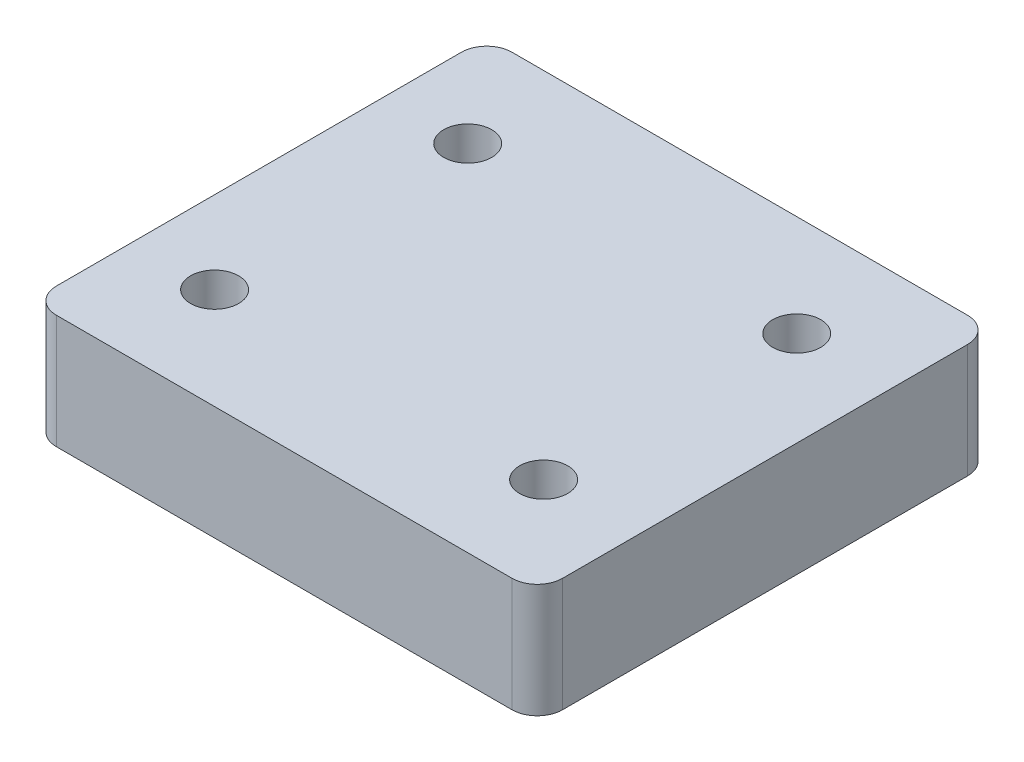
ISO-10303-21;
HEADER;
FILE_DESCRIPTION(('STEP AP214'),'2;1');
FILE_NAME('part.step','',(''),(''),'','','');
FILE_SCHEMA(('AUTOMOTIVE_DESIGN { 1 0 10303 214 1 1 1 1 }'));
ENDSEC;
DATA;
#1=APPLICATION_CONTEXT('core data for automotive mechanical design processes');
#2=APPLICATION_PROTOCOL_DEFINITION('international standard','automotive_design',2000,#1);
#3=PRODUCT_CONTEXT('',#1,'mechanical');
#4=PRODUCT('Part','Part','',(#3));
#5=PRODUCT_RELATED_PRODUCT_CATEGORY('part','',(#4));
#6=PRODUCT_DEFINITION_FORMATION('','',#4);
#7=PRODUCT_DEFINITION_CONTEXT('part definition',#1,'design');
#8=PRODUCT_DEFINITION('design','',#6,#7);
#9=PRODUCT_DEFINITION_SHAPE('','',#8);
#10=(LENGTH_UNIT() NAMED_UNIT(*) SI_UNIT(.MILLI.,.METRE.));
#11=(NAMED_UNIT(*) PLANE_ANGLE_UNIT() SI_UNIT($,.RADIAN.));
#12=(NAMED_UNIT(*) SI_UNIT($,.STERADIAN.) SOLID_ANGLE_UNIT());
#13=UNCERTAINTY_MEASURE_WITH_UNIT(LENGTH_MEASURE(1.E-05),#10,'distance_accuracy_value','');
#14=(GEOMETRIC_REPRESENTATION_CONTEXT(3) GLOBAL_UNCERTAINTY_ASSIGNED_CONTEXT((#13)) GLOBAL_UNIT_ASSIGNED_CONTEXT((#10,
#11,#12)) REPRESENTATION_CONTEXT('',''));
#15=CARTESIAN_POINT('',(0.,0.,0.));
#16=DIRECTION('',(0.,0.,1.));
#17=DIRECTION('',(1.,0.,0.));
#18=AXIS2_PLACEMENT_3D('',#15,#16,#17);
#19=CARTESIAN_POINT('',(-10.5177085809365,9.,-16.6807701449964));
#20=DIRECTION('',(1.,0.,0.));
#21=DIRECTION('',(0.,0.,-1.));
#22=AXIS2_PLACEMENT_3D('',#19,#20,#21);
#23=PLANE('',#22);
#24=DIRECTION('',(0.,0.,1.));
#25=VECTOR('',#24,1.);
#26=CARTESIAN_POINT('',(-10.5177085809365,9.,-16.6807701449964));
#27=LINE('',#26,#25);
#28=CARTESIAN_POINT('',(-10.5177085809365,9.,-14.6807701449964));
#29=VERTEX_POINT('',#28);
#30=CARTESIAN_POINT('',(-10.5177085809365,9.,17.3192298550036));
#31=VERTEX_POINT('',#30);
#32=EDGE_CURVE('E117',#29,#31,#27,.T.);
#33=ORIENTED_EDGE('',*,*,#32,.F.);
#34=DIRECTION('',(0.,-1.,0.));
#35=VECTOR('',#34,1.);
#36=CARTESIAN_POINT('',(-10.5177085809365,9.,-14.6807701449964));
#37=LINE('',#36,#35);
#38=CARTESIAN_POINT('',(-10.5177085809365,0.,-14.6807701449964));
#39=VERTEX_POINT('',#38);
#40=EDGE_CURVE('E102',#29,#39,#37,.T.);
#41=ORIENTED_EDGE('',*,*,#40,.T.);
#42=DIRECTION('',(0.,0.,1.));
#43=VECTOR('',#42,1.);
#44=CARTESIAN_POINT('',(-10.5177085809365,0.,-16.6807701449964));
#45=LINE('',#44,#43);
#46=CARTESIAN_POINT('',(-10.5177085809365,0.,17.3192298550036));
#47=VERTEX_POINT('',#46);
#48=EDGE_CURVE('E114',#39,#47,#45,.T.);
#49=ORIENTED_EDGE('',*,*,#48,.T.);
#50=DIRECTION('',(0.,-1.,0.));
#51=VECTOR('',#50,1.);
#52=CARTESIAN_POINT('',(-10.5177085809365,9.,17.3192298550036));
#53=LINE('',#52,#51);
#54=EDGE_CURVE('E119',#47,#31,#53,.F.);
#55=ORIENTED_EDGE('',*,*,#54,.T.);
#56=EDGE_LOOP('',(#33,#41,#49,#55));
#57=FACE_BOUND('',#56,.T.);
#58=ADVANCED_FACE('F33',(#57),#23,.F.);
#59=CARTESIAN_POINT('',(-10.5177085809365,9.,19.3192298550036));
#60=DIRECTION('',(0.,0.,-1.));
#61=DIRECTION('',(-1.,0.,0.));
#62=AXIS2_PLACEMENT_3D('',#59,#60,#61);
#63=PLANE('',#62);
#64=DIRECTION('',(1.,0.,0.));
#65=VECTOR('',#64,1.);
#66=CARTESIAN_POINT('',(-10.5177085809365,9.,19.3192298550036));
#67=LINE('',#66,#65);
#68=CARTESIAN_POINT('',(-8.5177085809365,9.,19.3192298550036));
#69=VERTEX_POINT('',#68);
#70=CARTESIAN_POINT('',(27.4822914190635,9.,19.3192298550036));
#71=VERTEX_POINT('',#70);
#72=EDGE_CURVE('E181',#69,#71,#67,.T.);
#73=ORIENTED_EDGE('',*,*,#72,.F.);
#74=DIRECTION('',(0.,-1.,0.));
#75=VECTOR('',#74,1.);
#76=CARTESIAN_POINT('',(-8.5177085809365,9.,19.3192298550036));
#77=LINE('',#76,#75);
#78=CARTESIAN_POINT('',(-8.5177085809365,0.,19.3192298550036));
#79=VERTEX_POINT('',#78);
#80=EDGE_CURVE('E165',#69,#79,#77,.T.);
#81=ORIENTED_EDGE('',*,*,#80,.T.);
#82=DIRECTION('',(1.,0.,0.));
#83=VECTOR('',#82,1.);
#84=CARTESIAN_POINT('',(-10.5177085809365,0.,19.3192298550036));
#85=LINE('',#84,#83);
#86=CARTESIAN_POINT('',(27.4822914190635,0.,19.3192298550036));
#87=VERTEX_POINT('',#86);
#88=EDGE_CURVE('E123',#79,#87,#85,.T.);
#89=ORIENTED_EDGE('',*,*,#88,.T.);
#90=DIRECTION('',(0.,-1.,0.));
#91=VECTOR('',#90,1.);
#92=CARTESIAN_POINT('',(27.4822914190635,9.,19.3192298550036));
#93=LINE('',#92,#91);
#94=EDGE_CURVE('E163',#87,#71,#93,.F.);
#95=ORIENTED_EDGE('',*,*,#94,.T.);
#96=EDGE_LOOP('',(#73,#81,#89,#95));
#97=FACE_BOUND('',#96,.T.);
#98=ADVANCED_FACE('F221',(#97),#63,.F.);
#99=CARTESIAN_POINT('',(29.4822914190635,9.,-16.6807701449964));
#100=DIRECTION('',(-1.,0.,0.));
#101=DIRECTION('',(0.,0.,1.));
#102=AXIS2_PLACEMENT_3D('',#99,#100,#101);
#103=PLANE('',#102);
#104=DIRECTION('',(0.,0.,-1.));
#105=VECTOR('',#104,1.);
#106=CARTESIAN_POINT('',(29.4822914190635,0.,-16.6807701449964));
#107=LINE('',#106,#105);
#108=CARTESIAN_POINT('',(29.4822914190635,0.,17.3192298550036));
#109=VERTEX_POINT('',#108);
#110=CARTESIAN_POINT('',(29.4822914190635,0.,-14.6807701449964));
#111=VERTEX_POINT('',#110);
#112=EDGE_CURVE('E127',#109,#111,#107,.T.);
#113=ORIENTED_EDGE('',*,*,#112,.T.);
#114=DIRECTION('',(0.,-1.,0.));
#115=VECTOR('',#114,1.);
#116=CARTESIAN_POINT('',(29.4822914190635,9.,-14.6807701449964));
#117=LINE('',#116,#115);
#118=CARTESIAN_POINT('',(29.4822914190635,9.,-14.6807701449964));
#119=VERTEX_POINT('',#118);
#120=EDGE_CURVE('E11',#111,#119,#117,.F.);
#121=ORIENTED_EDGE('',*,*,#120,.T.);
#122=DIRECTION('',(0.,0.,-1.));
#123=VECTOR('',#122,1.);
#124=CARTESIAN_POINT('',(29.4822914190635,9.,-16.6807701449964));
#125=LINE('',#124,#123);
#126=CARTESIAN_POINT('',(29.4822914190635,9.,17.3192298550036));
#127=VERTEX_POINT('',#126);
#128=EDGE_CURVE('E171',#127,#119,#125,.T.);
#129=ORIENTED_EDGE('',*,*,#128,.F.);
#130=DIRECTION('',(0.,-1.,0.));
#131=VECTOR('',#130,1.);
#132=CARTESIAN_POINT('',(29.4822914190635,9.,17.3192298550036));
#133=LINE('',#132,#131);
#134=EDGE_CURVE('E41',#127,#109,#133,.T.);
#135=ORIENTED_EDGE('',*,*,#134,.T.);
#136=EDGE_LOOP('',(#113,#121,#129,#135));
#137=FACE_BOUND('',#136,.T.);
#138=ADVANCED_FACE('F170',(#137),#103,.F.);
#139=CARTESIAN_POINT('',(-10.5177085809365,9.,-16.6807701449964));
#140=DIRECTION('',(0.,0.,1.));
#141=DIRECTION('',(1.,0.,0.));
#142=AXIS2_PLACEMENT_3D('',#139,#140,#141);
#143=PLANE('',#142);
#144=DIRECTION('',(-1.,0.,0.));
#145=VECTOR('',#144,1.);
#146=CARTESIAN_POINT('',(-10.5177085809365,0.,-16.6807701449964));
#147=LINE('',#146,#145);
#148=CARTESIAN_POINT('',(27.4822914190635,0.,-16.6807701449964));
#149=VERTEX_POINT('',#148);
#150=CARTESIAN_POINT('',(-8.5177085809365,0.,-16.6807701449964));
#151=VERTEX_POINT('',#150);
#152=EDGE_CURVE('E137',#149,#151,#147,.T.);
#153=ORIENTED_EDGE('',*,*,#152,.T.);
#154=DIRECTION('',(0.,-1.,0.));
#155=VECTOR('',#154,1.);
#156=CARTESIAN_POINT('',(-8.5177085809365,9.,-16.6807701449964));
#157=LINE('',#156,#155);
#158=CARTESIAN_POINT('',(-8.5177085809365,9.,-16.6807701449964));
#159=VERTEX_POINT('',#158);
#160=EDGE_CURVE('E103',#151,#159,#157,.F.);
#161=ORIENTED_EDGE('',*,*,#160,.T.);
#162=DIRECTION('',(-1.,0.,0.));
#163=VECTOR('',#162,1.);
#164=CARTESIAN_POINT('',(-10.5177085809365,9.,-16.6807701449964));
#165=LINE('',#164,#163);
#166=CARTESIAN_POINT('',(27.4822914190635,9.,-16.6807701449964));
#167=VERTEX_POINT('',#166);
#168=EDGE_CURVE('E133',#167,#159,#165,.T.);
#169=ORIENTED_EDGE('',*,*,#168,.F.);
#170=DIRECTION('',(0.,-1.,0.));
#171=VECTOR('',#170,1.);
#172=CARTESIAN_POINT('',(27.4822914190635,9.,-16.6807701449964));
#173=LINE('',#172,#171);
#174=EDGE_CURVE('E108',#167,#149,#173,.T.);
#175=ORIENTED_EDGE('',*,*,#174,.T.);
#176=EDGE_LOOP('',(#153,#161,#169,#175));
#177=FACE_BOUND('',#176,.T.);
#178=ADVANCED_FACE('F179',(#177),#143,.F.);
#179=CARTESIAN_POINT('',(0.,9.,0.));
#180=DIRECTION('',(0.,1.,0.));
#181=DIRECTION('',(0.,0.,1.));
#182=AXIS2_PLACEMENT_3D('',#179,#180,#181);
#183=PLANE('',#182);
#184=CARTESIAN_POINT('',(-4.0177085809365,9.,-8.68077014499643));
#185=DIRECTION('',(0.,1.,0.));
#186=DIRECTION('',(0.,0.,1.));
#187=AXIS2_PLACEMENT_3D('',#184,#185,#186);
#188=CIRCLE('',#187,1.9);
#189=CARTESIAN_POINT('',(-4.0177085809365,9.,-6.78077014499643));
#190=VERTEX_POINT('',#189);
#191=EDGE_CURVE('E188',#190,#190,#188,.T.);
#192=ORIENTED_EDGE('',*,*,#191,.F.);
#193=EDGE_LOOP('',(#192));
#194=FACE_BOUND('',#193,.T.);
#195=CARTESIAN_POINT('',(21.9822914190635,9.,-8.68077014499643));
#196=DIRECTION('',(0.,1.,0.));
#197=DIRECTION('',(0.,0.,1.));
#198=AXIS2_PLACEMENT_3D('',#195,#196,#197);
#199=CIRCLE('',#198,1.9);
#200=CARTESIAN_POINT('',(21.9822914190635,9.,-6.78077014499643));
#201=VERTEX_POINT('',#200);
#202=EDGE_CURVE('E191',#201,#201,#199,.T.);
#203=ORIENTED_EDGE('',*,*,#202,.F.);
#204=EDGE_LOOP('',(#203));
#205=FACE_BOUND('',#204,.T.);
#206=CARTESIAN_POINT('',(21.9822914190635,9.,11.3192298550036));
#207=DIRECTION('',(0.,1.,0.));
#208=DIRECTION('',(0.,0.,1.));
#209=AXIS2_PLACEMENT_3D('',#206,#207,#208);
#210=CIRCLE('',#209,1.9);
#211=CARTESIAN_POINT('',(21.9822914190635,9.,13.2192298550036));
#212=VERTEX_POINT('',#211);
#213=EDGE_CURVE('E187',#212,#212,#210,.T.);
#214=ORIENTED_EDGE('',*,*,#213,.F.);
#215=EDGE_LOOP('',(#214));
#216=FACE_BOUND('',#215,.T.);
#217=CARTESIAN_POINT('',(-4.0177085809365,9.,11.3192298550036));
#218=DIRECTION('',(0.,1.,0.));
#219=DIRECTION('',(0.,0.,1.));
#220=AXIS2_PLACEMENT_3D('',#217,#218,#219);
#221=CIRCLE('',#220,1.9);
#222=CARTESIAN_POINT('',(-4.0177085809365,9.,13.2192298550036));
#223=VERTEX_POINT('',#222);
#224=EDGE_CURVE('E143',#223,#223,#221,.T.);
#225=ORIENTED_EDGE('',*,*,#224,.F.);
#226=EDGE_LOOP('',(#225));
#227=FACE_BOUND('',#226,.T.);
#228=ORIENTED_EDGE('',*,*,#168,.T.);
#229=CARTESIAN_POINT('',(-8.5177085809365,9.,-14.6807701449964));
#230=DIRECTION('',(0.,1.,0.));
#231=DIRECTION('',(0.,0.,1.));
#232=AXIS2_PLACEMENT_3D('',#229,#230,#231);
#233=CIRCLE('',#232,2.);
#234=EDGE_CURVE('E161',#159,#29,#233,.T.);
#235=ORIENTED_EDGE('',*,*,#234,.T.);
#236=ORIENTED_EDGE('',*,*,#32,.T.);
#237=CARTESIAN_POINT('',(-8.5177085809365,9.,17.3192298550036));
#238=DIRECTION('',(0.,1.,0.));
#239=DIRECTION('',(0.,0.,1.));
#240=AXIS2_PLACEMENT_3D('',#237,#238,#239);
#241=CIRCLE('',#240,2.);
#242=EDGE_CURVE('E159',#31,#69,#241,.T.);
#243=ORIENTED_EDGE('',*,*,#242,.T.);
#244=ORIENTED_EDGE('',*,*,#72,.T.);
#245=CARTESIAN_POINT('',(27.4822914190635,9.,17.3192298550036));
#246=DIRECTION('',(0.,1.,0.));
#247=DIRECTION('',(0.,0.,1.));
#248=AXIS2_PLACEMENT_3D('',#245,#246,#247);
#249=CIRCLE('',#248,2.);
#250=EDGE_CURVE('E53',#71,#127,#249,.T.);
#251=ORIENTED_EDGE('',*,*,#250,.T.);
#252=ORIENTED_EDGE('',*,*,#128,.T.);
#253=CARTESIAN_POINT('',(27.4822914190635,9.,-14.6807701449964));
#254=DIRECTION('',(0.,1.,0.));
#255=DIRECTION('',(0.,0.,1.));
#256=AXIS2_PLACEMENT_3D('',#253,#254,#255);
#257=CIRCLE('',#256,2.);
#258=EDGE_CURVE('E157',#119,#167,#257,.T.);
#259=ORIENTED_EDGE('',*,*,#258,.T.);
#260=EDGE_LOOP('',(#228,#235,#236,#243,#244,#251,#252,#259));
#261=FACE_BOUND('',#260,.T.);
#262=ADVANCED_FACE('F200',(#194,#205,#216,#227,#261),#183,.T.);
#263=CARTESIAN_POINT('',(0.,0.,0.));
#264=DIRECTION('',(0.,1.,0.));
#265=DIRECTION('',(0.,0.,1.));
#266=AXIS2_PLACEMENT_3D('',#263,#264,#265);
#267=PLANE('',#266);
#268=CARTESIAN_POINT('',(-4.0177085809365,0.,-8.68077014499643));
#269=DIRECTION('',(0.,1.,0.));
#270=DIRECTION('',(0.,0.,1.));
#271=AXIS2_PLACEMENT_3D('',#268,#269,#270);
#272=CIRCLE('',#271,1.9);
#273=CARTESIAN_POINT('',(-4.0177085809365,0.,-6.78077014499643));
#274=VERTEX_POINT('',#273);
#275=EDGE_CURVE('E124',#274,#274,#272,.T.);
#276=ORIENTED_EDGE('',*,*,#275,.T.);
#277=EDGE_LOOP('',(#276));
#278=FACE_BOUND('',#277,.T.);
#279=CARTESIAN_POINT('',(21.9822914190635,0.,-8.68077014499643));
#280=DIRECTION('',(0.,1.,0.));
#281=DIRECTION('',(0.,0.,1.));
#282=AXIS2_PLACEMENT_3D('',#279,#280,#281);
#283=CIRCLE('',#282,1.9);
#284=CARTESIAN_POINT('',(21.9822914190635,0.,-6.78077014499643));
#285=VERTEX_POINT('',#284);
#286=EDGE_CURVE('E130',#285,#285,#283,.T.);
#287=ORIENTED_EDGE('',*,*,#286,.T.);
#288=EDGE_LOOP('',(#287));
#289=FACE_BOUND('',#288,.T.);
#290=CARTESIAN_POINT('',(21.9822914190635,0.,11.3192298550036));
#291=DIRECTION('',(0.,1.,0.));
#292=DIRECTION('',(0.,0.,1.));
#293=AXIS2_PLACEMENT_3D('',#290,#291,#292);
#294=CIRCLE('',#293,1.9);
#295=CARTESIAN_POINT('',(21.9822914190635,0.,13.2192298550036));
#296=VERTEX_POINT('',#295);
#297=EDGE_CURVE('E142',#296,#296,#294,.T.);
#298=ORIENTED_EDGE('',*,*,#297,.T.);
#299=EDGE_LOOP('',(#298));
#300=FACE_BOUND('',#299,.T.);
#301=CARTESIAN_POINT('',(-4.0177085809365,0.,11.3192298550036));
#302=DIRECTION('',(0.,1.,0.));
#303=DIRECTION('',(0.,0.,1.));
#304=AXIS2_PLACEMENT_3D('',#301,#302,#303);
#305=CIRCLE('',#304,1.9);
#306=CARTESIAN_POINT('',(-4.0177085809365,0.,13.2192298550036));
#307=VERTEX_POINT('',#306);
#308=EDGE_CURVE('E139',#307,#307,#305,.T.);
#309=ORIENTED_EDGE('',*,*,#308,.T.);
#310=EDGE_LOOP('',(#309));
#311=FACE_BOUND('',#310,.T.);
#312=ORIENTED_EDGE('',*,*,#48,.F.);
#313=CARTESIAN_POINT('',(-8.5177085809365,0.,-14.6807701449964));
#314=DIRECTION('',(0.,1.,0.));
#315=DIRECTION('',(0.,0.,1.));
#316=AXIS2_PLACEMENT_3D('',#313,#314,#315);
#317=CIRCLE('',#316,2.);
#318=EDGE_CURVE('E98',#39,#151,#317,.F.);
#319=ORIENTED_EDGE('',*,*,#318,.T.);
#320=ORIENTED_EDGE('',*,*,#152,.F.);
#321=CARTESIAN_POINT('',(27.4822914190635,0.,-14.6807701449964));
#322=DIRECTION('',(0.,1.,0.));
#323=DIRECTION('',(0.,0.,1.));
#324=AXIS2_PLACEMENT_3D('',#321,#322,#323);
#325=CIRCLE('',#324,2.);
#326=EDGE_CURVE('E150',#149,#111,#325,.F.);
#327=ORIENTED_EDGE('',*,*,#326,.T.);
#328=ORIENTED_EDGE('',*,*,#112,.F.);
#329=CARTESIAN_POINT('',(27.4822914190635,0.,17.3192298550036));
#330=DIRECTION('',(0.,1.,0.));
#331=DIRECTION('',(0.,0.,1.));
#332=AXIS2_PLACEMENT_3D('',#329,#330,#331);
#333=CIRCLE('',#332,2.);
#334=EDGE_CURVE('E118',#109,#87,#333,.F.);
#335=ORIENTED_EDGE('',*,*,#334,.T.);
#336=ORIENTED_EDGE('',*,*,#88,.F.);
#337=CARTESIAN_POINT('',(-8.5177085809365,0.,17.3192298550036));
#338=DIRECTION('',(0.,1.,0.));
#339=DIRECTION('',(0.,0.,1.));
#340=AXIS2_PLACEMENT_3D('',#337,#338,#339);
#341=CIRCLE('',#340,2.);
#342=EDGE_CURVE('E109',#79,#47,#341,.F.);
#343=ORIENTED_EDGE('',*,*,#342,.T.);
#344=EDGE_LOOP('',(#312,#319,#320,#327,#328,#335,#336,#343));
#345=FACE_BOUND('',#344,.T.);
#346=ADVANCED_FACE('F121',(#278,#289,#300,#311,#345),#267,.F.);
#347=CARTESIAN_POINT('',(-4.0177085809365,-1.,11.3192298550036));
#348=DIRECTION('',(0.,1.,0.));
#349=DIRECTION('',(0.,0.,1.));
#350=AXIS2_PLACEMENT_3D('',#347,#348,#349);
#351=CYLINDRICAL_SURFACE('',#350,1.9);
#352=ORIENTED_EDGE('',*,*,#224,.T.);
#353=EDGE_LOOP('',(#352));
#354=FACE_BOUND('',#353,.T.);
#355=ORIENTED_EDGE('',*,*,#308,.F.);
#356=EDGE_LOOP('',(#355));
#357=FACE_BOUND('',#356,.T.);
#358=ADVANCED_FACE('F207',(#354,#357),#351,.F.);
#359=CARTESIAN_POINT('',(21.9822914190635,-1.,11.3192298550036));
#360=DIRECTION('',(0.,1.,0.));
#361=DIRECTION('',(0.,0.,1.));
#362=AXIS2_PLACEMENT_3D('',#359,#360,#361);
#363=CYLINDRICAL_SURFACE('',#362,1.9);
#364=ORIENTED_EDGE('',*,*,#213,.T.);
#365=EDGE_LOOP('',(#364));
#366=FACE_BOUND('',#365,.T.);
#367=ORIENTED_EDGE('',*,*,#297,.F.);
#368=EDGE_LOOP('',(#367));
#369=FACE_BOUND('',#368,.T.);
#370=ADVANCED_FACE('F197',(#366,#369),#363,.F.);
#371=CARTESIAN_POINT('',(21.9822914190635,-1.,-8.68077014499643));
#372=DIRECTION('',(0.,1.,0.));
#373=DIRECTION('',(0.,0.,1.));
#374=AXIS2_PLACEMENT_3D('',#371,#372,#373);
#375=CYLINDRICAL_SURFACE('',#374,1.9);
#376=ORIENTED_EDGE('',*,*,#202,.T.);
#377=EDGE_LOOP('',(#376));
#378=FACE_BOUND('',#377,.T.);
#379=ORIENTED_EDGE('',*,*,#286,.F.);
#380=EDGE_LOOP('',(#379));
#381=FACE_BOUND('',#380,.T.);
#382=ADVANCED_FACE('F306',(#378,#381),#375,.F.);
#383=CARTESIAN_POINT('',(-4.0177085809365,-1.,-8.68077014499643));
#384=DIRECTION('',(0.,1.,0.));
#385=DIRECTION('',(0.,0.,1.));
#386=AXIS2_PLACEMENT_3D('',#383,#384,#385);
#387=CYLINDRICAL_SURFACE('',#386,1.9);
#388=ORIENTED_EDGE('',*,*,#191,.T.);
#389=EDGE_LOOP('',(#388));
#390=FACE_BOUND('',#389,.T.);
#391=ORIENTED_EDGE('',*,*,#275,.F.);
#392=EDGE_LOOP('',(#391));
#393=FACE_BOUND('',#392,.T.);
#394=ADVANCED_FACE('F233',(#390,#393),#387,.F.);
#395=CARTESIAN_POINT('',(-8.5177085809365,9.,-14.6807701449964));
#396=DIRECTION('',(0.,-1.,0.));
#397=DIRECTION('',(0.,0.,-1.));
#398=AXIS2_PLACEMENT_3D('',#395,#396,#397);
#399=CYLINDRICAL_SURFACE('',#398,2.);
#400=ORIENTED_EDGE('',*,*,#234,.F.);
#401=ORIENTED_EDGE('',*,*,#160,.F.);
#402=ORIENTED_EDGE('',*,*,#318,.F.);
#403=ORIENTED_EDGE('',*,*,#40,.F.);
#404=EDGE_LOOP('',(#400,#401,#402,#403));
#405=FACE_BOUND('',#404,.T.);
#406=ADVANCED_FACE('F101',(#405),#399,.T.);
#407=CARTESIAN_POINT('',(-8.5177085809365,9.,17.3192298550036));
#408=DIRECTION('',(0.,-1.,0.));
#409=DIRECTION('',(0.,0.,-1.));
#410=AXIS2_PLACEMENT_3D('',#407,#408,#409);
#411=CYLINDRICAL_SURFACE('',#410,2.);
#412=ORIENTED_EDGE('',*,*,#242,.F.);
#413=ORIENTED_EDGE('',*,*,#54,.F.);
#414=ORIENTED_EDGE('',*,*,#342,.F.);
#415=ORIENTED_EDGE('',*,*,#80,.F.);
#416=EDGE_LOOP('',(#412,#413,#414,#415));
#417=FACE_BOUND('',#416,.T.);
#418=ADVANCED_FACE('F232',(#417),#411,.T.);
#419=CARTESIAN_POINT('',(27.4822914190635,9.,-14.6807701449964));
#420=DIRECTION('',(0.,-1.,0.));
#421=DIRECTION('',(0.,0.,-1.));
#422=AXIS2_PLACEMENT_3D('',#419,#420,#421);
#423=CYLINDRICAL_SURFACE('',#422,2.);
#424=ORIENTED_EDGE('',*,*,#258,.F.);
#425=ORIENTED_EDGE('',*,*,#120,.F.);
#426=ORIENTED_EDGE('',*,*,#326,.F.);
#427=ORIENTED_EDGE('',*,*,#174,.F.);
#428=EDGE_LOOP('',(#424,#425,#426,#427));
#429=FACE_BOUND('',#428,.T.);
#430=ADVANCED_FACE('F176',(#429),#423,.T.);
#431=CARTESIAN_POINT('',(27.4822914190635,9.,17.3192298550036));
#432=DIRECTION('',(0.,-1.,0.));
#433=DIRECTION('',(0.,0.,-1.));
#434=AXIS2_PLACEMENT_3D('',#431,#432,#433);
#435=CYLINDRICAL_SURFACE('',#434,2.);
#436=ORIENTED_EDGE('',*,*,#250,.F.);
#437=ORIENTED_EDGE('',*,*,#94,.F.);
#438=ORIENTED_EDGE('',*,*,#334,.F.);
#439=ORIENTED_EDGE('',*,*,#134,.F.);
#440=EDGE_LOOP('',(#436,#437,#438,#439));
#441=FACE_BOUND('',#440,.T.);
#442=ADVANCED_FACE('F35',(#441),#435,.T.);
#443=CLOSED_SHELL('',(#58,#98,#138,#178,#262,#346,#358,#370,#382,#394,#406,#418,#430,#442));
#444=MANIFOLD_SOLID_BREP('B2',#443);
#445=ADVANCED_BREP_SHAPE_REPRESENTATION('',(#18,#444),#14);
#446=SHAPE_DEFINITION_REPRESENTATION(#9,#445);
ENDSEC;
END-ISO-10303-21;
